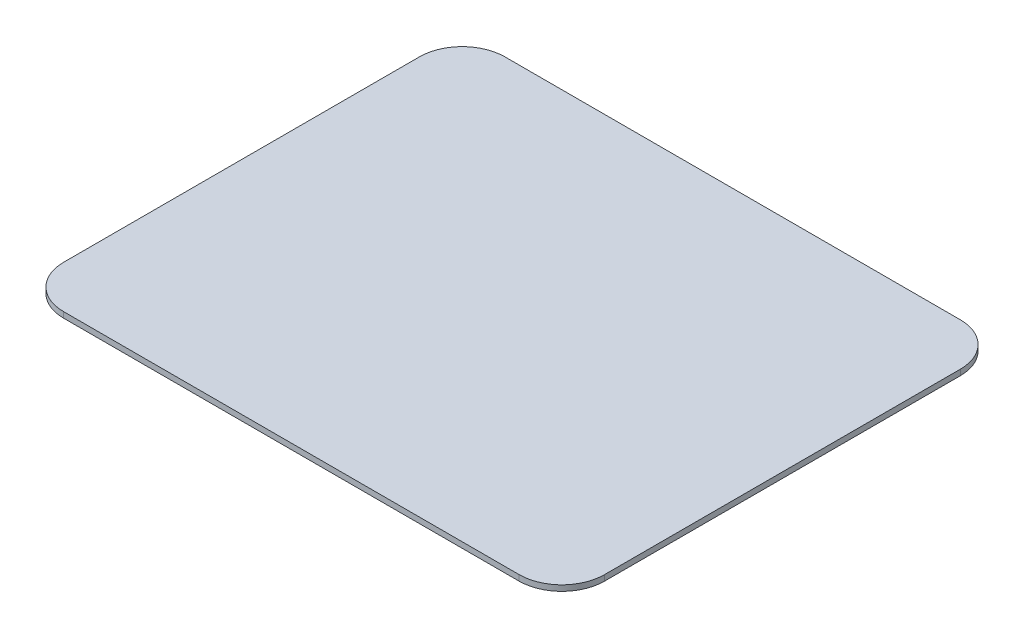
ISO-10303-21;
HEADER;
FILE_DESCRIPTION(('STEP AP214'),'2;1');
FILE_NAME('part.step','',(''),(''),'','','');
FILE_SCHEMA(('AUTOMOTIVE_DESIGN { 1 0 10303 214 1 1 1 1 }'));
ENDSEC;
DATA;
#1=APPLICATION_CONTEXT('core data for automotive mechanical design processes');
#2=APPLICATION_PROTOCOL_DEFINITION('international standard','automotive_design',2000,#1);
#3=PRODUCT_CONTEXT('',#1,'mechanical');
#4=PRODUCT('Part','Part','',(#3));
#5=PRODUCT_RELATED_PRODUCT_CATEGORY('part','',(#4));
#6=PRODUCT_DEFINITION_FORMATION('','',#4);
#7=PRODUCT_DEFINITION_CONTEXT('part definition',#1,'design');
#8=PRODUCT_DEFINITION('design','',#6,#7);
#9=PRODUCT_DEFINITION_SHAPE('','',#8);
#10=(LENGTH_UNIT() NAMED_UNIT(*) SI_UNIT(.MILLI.,.METRE.));
#11=(NAMED_UNIT(*) PLANE_ANGLE_UNIT() SI_UNIT($,.RADIAN.));
#12=(NAMED_UNIT(*) SI_UNIT($,.STERADIAN.) SOLID_ANGLE_UNIT());
#13=UNCERTAINTY_MEASURE_WITH_UNIT(LENGTH_MEASURE(1.E-05),#10,'distance_accuracy_value','');
#14=(GEOMETRIC_REPRESENTATION_CONTEXT(3) GLOBAL_UNCERTAINTY_ASSIGNED_CONTEXT((#13)) GLOBAL_UNIT_ASSIGNED_CONTEXT((#10,
#11,#12)) REPRESENTATION_CONTEXT('',''));
#15=CARTESIAN_POINT('',(0.,0.,0.));
#16=DIRECTION('',(0.,0.,1.));
#17=DIRECTION('',(1.,0.,0.));
#18=AXIS2_PLACEMENT_3D('',#15,#16,#17);
#19=CARTESIAN_POINT('',(-160.,4.,-125.));
#20=DIRECTION('',(0.,-1.,0.));
#21=DIRECTION('',(0.,0.,-1.));
#22=AXIS2_PLACEMENT_3D('',#19,#20,#21);
#23=CYLINDRICAL_SURFACE('',#22,30.);
#24=CARTESIAN_POINT('',(-160.,0.,-125.));
#25=DIRECTION('',(0.,1.,0.));
#26=DIRECTION('',(0.,0.,-1.));
#27=AXIS2_PLACEMENT_3D('',#24,#25,#26);
#28=CIRCLE('',#27,30.);
#29=CARTESIAN_POINT('',(-160.,0.,-155.));
#30=VERTEX_POINT('',#29);
#31=CARTESIAN_POINT('',(-190.,0.,-125.));
#32=VERTEX_POINT('',#31);
#33=EDGE_CURVE('E159',#30,#32,#28,.T.);
#34=ORIENTED_EDGE('',*,*,#33,.T.);
#35=DIRECTION('',(0.,-1.,0.));
#36=VECTOR('',#35,1.);
#37=CARTESIAN_POINT('',(-190.,4.,-125.));
#38=LINE('',#37,#36);
#39=CARTESIAN_POINT('',(-190.,4.,-125.));
#40=VERTEX_POINT('',#39);
#41=EDGE_CURVE('E11',#40,#32,#38,.T.);
#42=ORIENTED_EDGE('',*,*,#41,.F.);
#43=CARTESIAN_POINT('',(-160.,4.,-125.));
#44=DIRECTION('',(0.,1.,0.));
#45=DIRECTION('',(0.,0.,-1.));
#46=AXIS2_PLACEMENT_3D('',#43,#44,#45);
#47=CIRCLE('',#46,30.);
#48=CARTESIAN_POINT('',(-160.,4.,-155.));
#49=VERTEX_POINT('',#48);
#50=EDGE_CURVE('E180',#49,#40,#47,.T.);
#51=ORIENTED_EDGE('',*,*,#50,.F.);
#52=DIRECTION('',(0.,-1.,0.));
#53=VECTOR('',#52,1.);
#54=CARTESIAN_POINT('',(-160.,4.,-155.));
#55=LINE('',#54,#53);
#56=EDGE_CURVE('E155',#49,#30,#55,.T.);
#57=ORIENTED_EDGE('',*,*,#56,.T.);
#58=EDGE_LOOP('',(#34,#42,#51,#57));
#59=FACE_BOUND('',#58,.T.);
#60=ADVANCED_FACE('F40',(#59),#23,.T.);
#61=CARTESIAN_POINT('',(-190.,4.,125.));
#62=DIRECTION('',(1.,0.,0.));
#63=DIRECTION('',(0.,0.,-1.));
#64=AXIS2_PLACEMENT_3D('',#61,#62,#63);
#65=PLANE('',#64);
#66=DIRECTION('',(0.,0.,1.));
#67=VECTOR('',#66,1.);
#68=CARTESIAN_POINT('',(-190.,0.,125.));
#69=LINE('',#68,#67);
#70=CARTESIAN_POINT('',(-190.,0.,125.));
#71=VERTEX_POINT('',#70);
#72=EDGE_CURVE('E163',#32,#71,#69,.T.);
#73=ORIENTED_EDGE('',*,*,#72,.T.);
#74=DIRECTION('',(0.,-1.,0.));
#75=VECTOR('',#74,1.);
#76=CARTESIAN_POINT('',(-190.,4.,125.));
#77=LINE('',#76,#75);
#78=CARTESIAN_POINT('',(-190.,4.,125.));
#79=VERTEX_POINT('',#78);
#80=EDGE_CURVE('E49',#79,#71,#77,.T.);
#81=ORIENTED_EDGE('',*,*,#80,.F.);
#82=DIRECTION('',(0.,0.,1.));
#83=VECTOR('',#82,1.);
#84=CARTESIAN_POINT('',(-190.,4.,125.));
#85=LINE('',#84,#83);
#86=EDGE_CURVE('E113',#40,#79,#85,.T.);
#87=ORIENTED_EDGE('',*,*,#86,.F.);
#88=ORIENTED_EDGE('',*,*,#41,.T.);
#89=EDGE_LOOP('',(#73,#81,#87,#88));
#90=FACE_BOUND('',#89,.T.);
#91=ADVANCED_FACE('F225',(#90),#65,.F.);
#92=CARTESIAN_POINT('',(-160.,4.,125.));
#93=DIRECTION('',(0.,-1.,0.));
#94=DIRECTION('',(0.,0.,-1.));
#95=AXIS2_PLACEMENT_3D('',#92,#93,#94);
#96=CYLINDRICAL_SURFACE('',#95,30.);
#97=CARTESIAN_POINT('',(-160.,0.,125.));
#98=DIRECTION('',(0.,1.,0.));
#99=DIRECTION('',(0.,0.,-1.));
#100=AXIS2_PLACEMENT_3D('',#97,#98,#99);
#101=CIRCLE('',#100,30.);
#102=CARTESIAN_POINT('',(-160.,0.,155.));
#103=VERTEX_POINT('',#102);
#104=EDGE_CURVE('E166',#71,#103,#101,.T.);
#105=ORIENTED_EDGE('',*,*,#104,.T.);
#106=DIRECTION('',(0.,-1.,0.));
#107=VECTOR('',#106,1.);
#108=CARTESIAN_POINT('',(-160.,4.,155.));
#109=LINE('',#108,#107);
#110=CARTESIAN_POINT('',(-160.,4.,155.));
#111=VERTEX_POINT('',#110);
#112=EDGE_CURVE('E190',#111,#103,#109,.T.);
#113=ORIENTED_EDGE('',*,*,#112,.F.);
#114=CARTESIAN_POINT('',(-160.,4.,125.));
#115=DIRECTION('',(0.,1.,0.));
#116=DIRECTION('',(0.,0.,-1.));
#117=AXIS2_PLACEMENT_3D('',#114,#115,#116);
#118=CIRCLE('',#117,30.);
#119=EDGE_CURVE('E201',#79,#111,#118,.T.);
#120=ORIENTED_EDGE('',*,*,#119,.F.);
#121=ORIENTED_EDGE('',*,*,#80,.T.);
#122=EDGE_LOOP('',(#105,#113,#120,#121));
#123=FACE_BOUND('',#122,.T.);
#124=ADVANCED_FACE('F199',(#123),#96,.T.);
#125=CARTESIAN_POINT('',(160.,4.,155.));
#126=DIRECTION('',(0.,0.,-1.));
#127=DIRECTION('',(-1.,0.,0.));
#128=AXIS2_PLACEMENT_3D('',#125,#126,#127);
#129=PLANE('',#128);
#130=DIRECTION('',(1.,0.,0.));
#131=VECTOR('',#130,1.);
#132=CARTESIAN_POINT('',(160.,0.,155.));
#133=LINE('',#132,#131);
#134=CARTESIAN_POINT('',(160.,0.,155.));
#135=VERTEX_POINT('',#134);
#136=EDGE_CURVE('E169',#103,#135,#133,.T.);
#137=ORIENTED_EDGE('',*,*,#136,.T.);
#138=DIRECTION('',(0.,-1.,0.));
#139=VECTOR('',#138,1.);
#140=CARTESIAN_POINT('',(160.,4.,155.));
#141=LINE('',#140,#139);
#142=CARTESIAN_POINT('',(160.,4.,155.));
#143=VERTEX_POINT('',#142);
#144=EDGE_CURVE('E186',#143,#135,#141,.T.);
#145=ORIENTED_EDGE('',*,*,#144,.F.);
#146=DIRECTION('',(1.,0.,0.));
#147=VECTOR('',#146,1.);
#148=CARTESIAN_POINT('',(160.,4.,155.));
#149=LINE('',#148,#147);
#150=EDGE_CURVE('E214',#111,#143,#149,.T.);
#151=ORIENTED_EDGE('',*,*,#150,.F.);
#152=ORIENTED_EDGE('',*,*,#112,.T.);
#153=EDGE_LOOP('',(#137,#145,#151,#152));
#154=FACE_BOUND('',#153,.T.);
#155=ADVANCED_FACE('F209',(#154),#129,.F.);
#156=CARTESIAN_POINT('',(160.,4.,125.));
#157=DIRECTION('',(0.,-1.,0.));
#158=DIRECTION('',(0.,0.,-1.));
#159=AXIS2_PLACEMENT_3D('',#156,#157,#158);
#160=CYLINDRICAL_SURFACE('',#159,30.);
#161=CARTESIAN_POINT('',(160.,0.,125.));
#162=DIRECTION('',(0.,1.,0.));
#163=DIRECTION('',(0.,0.,-1.));
#164=AXIS2_PLACEMENT_3D('',#161,#162,#163);
#165=CIRCLE('',#164,30.);
#166=CARTESIAN_POINT('',(190.,0.,125.));
#167=VERTEX_POINT('',#166);
#168=EDGE_CURVE('E172',#135,#167,#165,.T.);
#169=ORIENTED_EDGE('',*,*,#168,.T.);
#170=DIRECTION('',(0.,-1.,0.));
#171=VECTOR('',#170,1.);
#172=CARTESIAN_POINT('',(190.,4.,125.));
#173=LINE('',#172,#171);
#174=CARTESIAN_POINT('',(190.,4.,125.));
#175=VERTEX_POINT('',#174);
#176=EDGE_CURVE('E146',#175,#167,#173,.T.);
#177=ORIENTED_EDGE('',*,*,#176,.F.);
#178=CARTESIAN_POINT('',(160.,4.,125.));
#179=DIRECTION('',(0.,1.,0.));
#180=DIRECTION('',(0.,0.,-1.));
#181=AXIS2_PLACEMENT_3D('',#178,#179,#180);
#182=CIRCLE('',#181,30.);
#183=EDGE_CURVE('E135',#143,#175,#182,.T.);
#184=ORIENTED_EDGE('',*,*,#183,.F.);
#185=ORIENTED_EDGE('',*,*,#144,.T.);
#186=EDGE_LOOP('',(#169,#177,#184,#185));
#187=FACE_BOUND('',#186,.T.);
#188=ADVANCED_FACE('F212',(#187),#160,.T.);
#189=CARTESIAN_POINT('',(190.,4.,125.));
#190=DIRECTION('',(-1.,0.,0.));
#191=DIRECTION('',(0.,0.,1.));
#192=AXIS2_PLACEMENT_3D('',#189,#190,#191);
#193=PLANE('',#192);
#194=DIRECTION('',(0.,0.,-1.));
#195=VECTOR('',#194,1.);
#196=CARTESIAN_POINT('',(190.,0.,125.));
#197=LINE('',#196,#195);
#198=CARTESIAN_POINT('',(190.,0.,-125.));
#199=VERTEX_POINT('',#198);
#200=EDGE_CURVE('E144',#167,#199,#197,.T.);
#201=ORIENTED_EDGE('',*,*,#200,.T.);
#202=DIRECTION('',(0.,-1.,0.));
#203=VECTOR('',#202,1.);
#204=CARTESIAN_POINT('',(190.,4.,-125.));
#205=LINE('',#204,#203);
#206=CARTESIAN_POINT('',(190.,4.,-125.));
#207=VERTEX_POINT('',#206);
#208=EDGE_CURVE('E141',#207,#199,#205,.T.);
#209=ORIENTED_EDGE('',*,*,#208,.F.);
#210=DIRECTION('',(0.,0.,-1.));
#211=VECTOR('',#210,1.);
#212=CARTESIAN_POINT('',(190.,4.,125.));
#213=LINE('',#212,#211);
#214=EDGE_CURVE('E129',#175,#207,#213,.T.);
#215=ORIENTED_EDGE('',*,*,#214,.F.);
#216=ORIENTED_EDGE('',*,*,#176,.T.);
#217=EDGE_LOOP('',(#201,#209,#215,#216));
#218=FACE_BOUND('',#217,.T.);
#219=ADVANCED_FACE('F142',(#218),#193,.F.);
#220=CARTESIAN_POINT('',(160.,4.,-125.));
#221=DIRECTION('',(0.,-1.,0.));
#222=DIRECTION('',(0.,0.,-1.));
#223=AXIS2_PLACEMENT_3D('',#220,#221,#222);
#224=CYLINDRICAL_SURFACE('',#223,30.);
#225=CARTESIAN_POINT('',(160.,0.,-125.));
#226=DIRECTION('',(0.,1.,0.));
#227=DIRECTION('',(0.,0.,1.));
#228=AXIS2_PLACEMENT_3D('',#225,#226,#227);
#229=CIRCLE('',#228,30.);
#230=CARTESIAN_POINT('',(160.,0.,-155.));
#231=VERTEX_POINT('',#230);
#232=EDGE_CURVE('E97',#199,#231,#229,.T.);
#233=ORIENTED_EDGE('',*,*,#232,.T.);
#234=DIRECTION('',(0.,-1.,0.));
#235=VECTOR('',#234,1.);
#236=CARTESIAN_POINT('',(160.,4.,-155.));
#237=LINE('',#236,#235);
#238=CARTESIAN_POINT('',(160.,4.,-155.));
#239=VERTEX_POINT('',#238);
#240=EDGE_CURVE('E147',#239,#231,#237,.T.);
#241=ORIENTED_EDGE('',*,*,#240,.F.);
#242=CARTESIAN_POINT('',(160.,4.,-125.));
#243=DIRECTION('',(0.,1.,0.));
#244=DIRECTION('',(0.,0.,1.));
#245=AXIS2_PLACEMENT_3D('',#242,#243,#244);
#246=CIRCLE('',#245,30.);
#247=EDGE_CURVE('E133',#207,#239,#246,.T.);
#248=ORIENTED_EDGE('',*,*,#247,.F.);
#249=ORIENTED_EDGE('',*,*,#208,.T.);
#250=EDGE_LOOP('',(#233,#241,#248,#249));
#251=FACE_BOUND('',#250,.T.);
#252=ADVANCED_FACE('F149',(#251),#224,.T.);
#253=CARTESIAN_POINT('',(160.,4.,-155.));
#254=DIRECTION('',(0.,0.,1.));
#255=DIRECTION('',(1.,0.,0.));
#256=AXIS2_PLACEMENT_3D('',#253,#254,#255);
#257=PLANE('',#256);
#258=DIRECTION('',(-1.,0.,0.));
#259=VECTOR('',#258,1.);
#260=CARTESIAN_POINT('',(160.,0.,-155.));
#261=LINE('',#260,#259);
#262=EDGE_CURVE('E103',#231,#30,#261,.T.);
#263=ORIENTED_EDGE('',*,*,#262,.T.);
#264=ORIENTED_EDGE('',*,*,#56,.F.);
#265=DIRECTION('',(-1.,0.,0.));
#266=VECTOR('',#265,1.);
#267=CARTESIAN_POINT('',(160.,4.,-155.));
#268=LINE('',#267,#266);
#269=EDGE_CURVE('E60',#239,#49,#268,.T.);
#270=ORIENTED_EDGE('',*,*,#269,.F.);
#271=ORIENTED_EDGE('',*,*,#240,.T.);
#272=EDGE_LOOP('',(#263,#264,#270,#271));
#273=FACE_BOUND('',#272,.T.);
#274=ADVANCED_FACE('F241',(#273),#257,.F.);
#275=CARTESIAN_POINT('',(-160.,4.,-125.));
#276=DIRECTION('',(0.,-1.,0.));
#277=DIRECTION('',(0.,0.,-1.));
#278=AXIS2_PLACEMENT_3D('',#275,#276,#277);
#279=PLANE('',#278);
#280=ORIENTED_EDGE('',*,*,#50,.T.);
#281=ORIENTED_EDGE('',*,*,#86,.T.);
#282=ORIENTED_EDGE('',*,*,#119,.T.);
#283=ORIENTED_EDGE('',*,*,#150,.T.);
#284=ORIENTED_EDGE('',*,*,#183,.T.);
#285=ORIENTED_EDGE('',*,*,#214,.T.);
#286=ORIENTED_EDGE('',*,*,#247,.T.);
#287=ORIENTED_EDGE('',*,*,#269,.T.);
#288=EDGE_LOOP('',(#280,#281,#282,#283,#284,#285,#286,#287));
#289=FACE_BOUND('',#288,.T.);
#290=ADVANCED_FACE('F131',(#289),#279,.F.);
#291=CARTESIAN_POINT('',(-160.,0.,-125.));
#292=DIRECTION('',(0.,-1.,0.));
#293=DIRECTION('',(0.,0.,-1.));
#294=AXIS2_PLACEMENT_3D('',#291,#292,#293);
#295=PLANE('',#294);
#296=ORIENTED_EDGE('',*,*,#33,.F.);
#297=ORIENTED_EDGE('',*,*,#262,.F.);
#298=ORIENTED_EDGE('',*,*,#232,.F.);
#299=ORIENTED_EDGE('',*,*,#200,.F.);
#300=ORIENTED_EDGE('',*,*,#168,.F.);
#301=ORIENTED_EDGE('',*,*,#136,.F.);
#302=ORIENTED_EDGE('',*,*,#104,.F.);
#303=ORIENTED_EDGE('',*,*,#72,.F.);
#304=EDGE_LOOP('',(#296,#297,#298,#299,#300,#301,#302,#303));
#305=FACE_BOUND('',#304,.T.);
#306=ADVANCED_FACE('F205',(#305),#295,.T.);
#307=CLOSED_SHELL('',(#60,#91,#124,#155,#188,#219,#252,#274,#290,#306));
#308=MANIFOLD_SOLID_BREP('B2',#307);
#309=ADVANCED_BREP_SHAPE_REPRESENTATION('',(#18,#308),#14);
#310=SHAPE_DEFINITION_REPRESENTATION(#9,#309);
ENDSEC;
END-ISO-10303-21;
